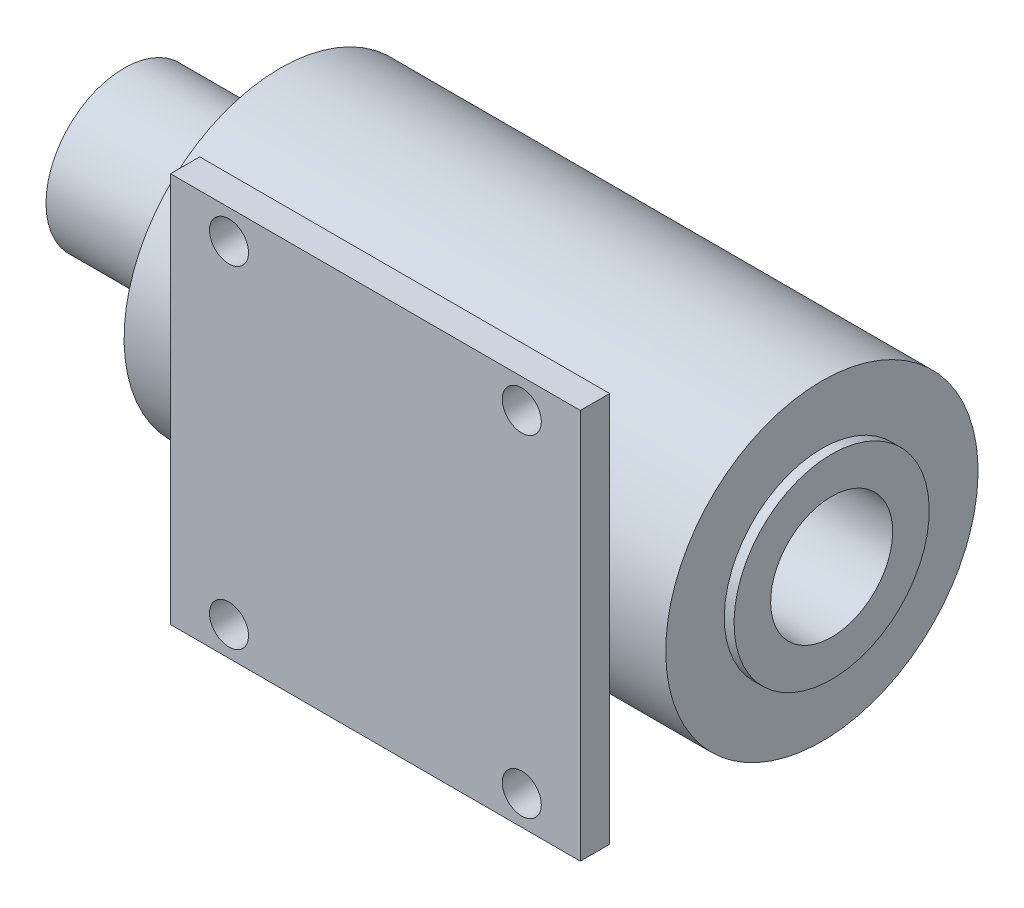
ISO-10303-21;
HEADER;
FILE_DESCRIPTION(('STEP AP214'),'2;1');
FILE_NAME('part.step','',(''),(''),'','','');
FILE_SCHEMA(('AUTOMOTIVE_DESIGN { 1 0 10303 214 1 1 1 1 }'));
ENDSEC;
DATA;
#1=APPLICATION_CONTEXT('core data for automotive mechanical design processes');
#2=APPLICATION_PROTOCOL_DEFINITION('international standard','automotive_design',2000,#1);
#3=PRODUCT_CONTEXT('',#1,'mechanical');
#4=PRODUCT('Part','Part','',(#3));
#5=PRODUCT_RELATED_PRODUCT_CATEGORY('part','',(#4));
#6=PRODUCT_DEFINITION_FORMATION('','',#4);
#7=PRODUCT_DEFINITION_CONTEXT('part definition',#1,'design');
#8=PRODUCT_DEFINITION('design','',#6,#7);
#9=PRODUCT_DEFINITION_SHAPE('','',#8);
#10=(LENGTH_UNIT() NAMED_UNIT(*) SI_UNIT(.MILLI.,.METRE.));
#11=(NAMED_UNIT(*) PLANE_ANGLE_UNIT() SI_UNIT($,.RADIAN.));
#12=(NAMED_UNIT(*) SI_UNIT($,.STERADIAN.) SOLID_ANGLE_UNIT());
#13=UNCERTAINTY_MEASURE_WITH_UNIT(LENGTH_MEASURE(1.E-05),#10,'distance_accuracy_value','');
#14=(GEOMETRIC_REPRESENTATION_CONTEXT(3) GLOBAL_UNCERTAINTY_ASSIGNED_CONTEXT((#13)) GLOBAL_UNIT_ASSIGNED_CONTEXT((#10,
#11,#12)) REPRESENTATION_CONTEXT('',''));
#15=CARTESIAN_POINT('',(0.,0.,0.));
#16=DIRECTION('',(0.,0.,1.));
#17=DIRECTION('',(1.,0.,0.));
#18=AXIS2_PLACEMENT_3D('',#15,#16,#17);
#19=CARTESIAN_POINT('',(36.5703722048743,-5.90587953913225,-16.));
#20=DIRECTION('',(1.,0.,0.));
#21=DIRECTION('',(0.,1.,0.));
#22=AXIS2_PLACEMENT_3D('',#19,#20,#21);
#23=PLANE('',#22);
#24=CARTESIAN_POINT('',(36.5703722048743,-5.90587953913225,-16.));
#25=DIRECTION('',(1.,0.,0.));
#26=DIRECTION('',(0.,1.,0.));
#27=AXIS2_PLACEMENT_3D('',#24,#25,#26);
#28=CIRCLE('',#27,16.);
#29=CARTESIAN_POINT('',(36.5703722048743,10.0941204608678,-16.));
#30=VERTEX_POINT('',#29);
#31=EDGE_CURVE('E51',#30,#30,#28,.T.);
#32=ORIENTED_EDGE('',*,*,#31,.T.);
#33=EDGE_LOOP('',(#32));
#34=FACE_BOUND('',#33,.T.);
#35=CARTESIAN_POINT('',(36.5703722048743,-5.90587953913225,-16.));
#36=DIRECTION('',(1.,0.,0.));
#37=DIRECTION('',(0.,1.,0.));
#38=AXIS2_PLACEMENT_3D('',#35,#36,#37);
#39=CIRCLE('',#38,10.);
#40=CARTESIAN_POINT('',(36.5703722048743,4.09412046086775,-16.));
#41=VERTEX_POINT('',#40);
#42=EDGE_CURVE('E61',#41,#41,#39,.T.);
#43=ORIENTED_EDGE('',*,*,#42,.F.);
#44=EDGE_LOOP('',(#43));
#45=FACE_BOUND('',#44,.T.);
#46=ADVANCED_FACE('F40',(#34,#45),#23,.T.);
#47=CARTESIAN_POINT('',(-18.9296277951257,-5.90587953913226,-16.));
#48=DIRECTION('',(1.,0.,0.));
#49=DIRECTION('',(0.,1.,0.));
#50=AXIS2_PLACEMENT_3D('',#47,#48,#49);
#51=PLANE('',#50);
#52=CARTESIAN_POINT('',(-18.9296277951257,-5.90587953913226,-16.));
#53=DIRECTION('',(1.,0.,0.));
#54=DIRECTION('',(0.,1.,0.));
#55=AXIS2_PLACEMENT_3D('',#52,#53,#54);
#56=CIRCLE('',#55,16.);
#57=CARTESIAN_POINT('',(-18.9296277951257,10.0941204608677,-16.));
#58=VERTEX_POINT('',#57);
#59=EDGE_CURVE('E47',#58,#58,#56,.T.);
#60=ORIENTED_EDGE('',*,*,#59,.F.);
#61=EDGE_LOOP('',(#60));
#62=FACE_BOUND('',#61,.T.);
#63=CARTESIAN_POINT('',(-18.9296277951257,-5.90587953913226,-16.));
#64=DIRECTION('',(1.,0.,0.));
#65=DIRECTION('',(0.,1.,0.));
#66=AXIS2_PLACEMENT_3D('',#63,#64,#65);
#67=CIRCLE('',#66,8.);
#68=CARTESIAN_POINT('',(-18.9296277951257,2.09412046086774,-16.));
#69=VERTEX_POINT('',#68);
#70=EDGE_CURVE('E11',#69,#69,#67,.F.);
#71=ORIENTED_EDGE('',*,*,#70,.F.);
#72=EDGE_LOOP('',(#71));
#73=FACE_BOUND('',#72,.T.);
#74=ADVANCED_FACE('F113',(#62,#73),#51,.F.);
#75=CARTESIAN_POINT('',(-18.9296277951257,-5.90587953913226,-16.));
#76=DIRECTION('',(1.,0.,0.));
#77=DIRECTION('',(0.,1.,0.));
#78=AXIS2_PLACEMENT_3D('',#75,#76,#77);
#79=CYLINDRICAL_SURFACE('',#78,16.);
#80=ORIENTED_EDGE('',*,*,#59,.T.);
#81=EDGE_LOOP('',(#80));
#82=FACE_BOUND('',#81,.T.);
#83=ORIENTED_EDGE('',*,*,#31,.F.);
#84=EDGE_LOOP('',(#83));
#85=FACE_BOUND('',#84,.T.);
#86=ADVANCED_FACE('F42',(#82,#85),#79,.T.);
#87=CARTESIAN_POINT('',(-34.9296277951257,-5.90587953913226,-16.));
#88=DIRECTION('',(1.,0.,0.));
#89=DIRECTION('',(0.,1.,0.));
#90=AXIS2_PLACEMENT_3D('',#87,#88,#89);
#91=CYLINDRICAL_SURFACE('',#90,8.);
#92=CARTESIAN_POINT('',(-34.9296277951257,-5.90587953913226,-16.));
#93=DIRECTION('',(-1.,0.,0.));
#94=DIRECTION('',(0.,-1.,0.));
#95=AXIS2_PLACEMENT_3D('',#92,#93,#94);
#96=CIRCLE('',#95,8.);
#97=CARTESIAN_POINT('',(-34.9296277951257,-13.9058795391323,-16.));
#98=VERTEX_POINT('',#97);
#99=EDGE_CURVE('E55',#98,#98,#96,.T.);
#100=ORIENTED_EDGE('',*,*,#99,.F.);
#101=EDGE_LOOP('',(#100));
#102=FACE_BOUND('',#101,.T.);
#103=ORIENTED_EDGE('',*,*,#70,.T.);
#104=EDGE_LOOP('',(#103));
#105=FACE_BOUND('',#104,.T.);
#106=ADVANCED_FACE('F121',(#102,#105),#91,.T.);
#107=CARTESIAN_POINT('',(-34.9296277951257,-5.90587953913226,-16.));
#108=DIRECTION('',(-1.,0.,0.));
#109=DIRECTION('',(0.,-1.,0.));
#110=AXIS2_PLACEMENT_3D('',#107,#108,#109);
#111=PLANE('',#110);
#112=CARTESIAN_POINT('',(-34.9296277951257,-5.90587953913226,-16.));
#113=DIRECTION('',(1.,0.,0.));
#114=DIRECTION('',(0.,1.,0.));
#115=AXIS2_PLACEMENT_3D('',#112,#113,#114);
#116=CIRCLE('',#115,2.38125);
#117=CARTESIAN_POINT('',(-34.9296277951257,-3.52462953913226,-16.));
#118=VERTEX_POINT('',#117);
#119=EDGE_CURVE('E70',#118,#118,#116,.T.);
#120=ORIENTED_EDGE('',*,*,#119,.T.);
#121=EDGE_LOOP('',(#120));
#122=FACE_BOUND('',#121,.T.);
#123=ORIENTED_EDGE('',*,*,#99,.T.);
#124=EDGE_LOOP('',(#123));
#125=FACE_BOUND('',#124,.T.);
#126=ADVANCED_FACE('F79',(#122,#125),#111,.T.);
#127=CARTESIAN_POINT('',(37.5703722048743,-5.90587953913225,-16.));
#128=DIRECTION('',(-1.,0.,0.));
#129=DIRECTION('',(0.,-1.,0.));
#130=AXIS2_PLACEMENT_3D('',#127,#128,#129);
#131=CYLINDRICAL_SURFACE('',#130,10.);
#132=CARTESIAN_POINT('',(37.5703722048743,-5.90587953913225,-16.));
#133=DIRECTION('',(1.,0.,0.));
#134=DIRECTION('',(0.,1.,0.));
#135=AXIS2_PLACEMENT_3D('',#132,#133,#134);
#136=CIRCLE('',#135,10.);
#137=CARTESIAN_POINT('',(37.5703722048743,4.09412046086775,-16.));
#138=VERTEX_POINT('',#137);
#139=EDGE_CURVE('E60',#138,#138,#136,.T.);
#140=ORIENTED_EDGE('',*,*,#139,.F.);
#141=EDGE_LOOP('',(#140));
#142=FACE_BOUND('',#141,.T.);
#143=ORIENTED_EDGE('',*,*,#42,.T.);
#144=EDGE_LOOP('',(#143));
#145=FACE_BOUND('',#144,.T.);
#146=ADVANCED_FACE('F103',(#142,#145),#131,.T.);
#147=CARTESIAN_POINT('',(37.5703722048743,-5.90587953913225,-16.));
#148=DIRECTION('',(1.,0.,0.));
#149=DIRECTION('',(0.,1.,0.));
#150=AXIS2_PLACEMENT_3D('',#147,#148,#149);
#151=PLANE('',#150);
#152=CARTESIAN_POINT('',(37.5703722048743,-5.90587953913225,-16.));
#153=DIRECTION('',(1.,0.,0.));
#154=DIRECTION('',(0.,1.,0.));
#155=AXIS2_PLACEMENT_3D('',#152,#153,#154);
#156=CIRCLE('',#155,6.25);
#157=CARTESIAN_POINT('',(37.5703722048743,0.344120460867751,-16.));
#158=VERTEX_POINT('',#157);
#159=EDGE_CURVE('E67',#158,#158,#156,.T.);
#160=ORIENTED_EDGE('',*,*,#159,.F.);
#161=EDGE_LOOP('',(#160));
#162=FACE_BOUND('',#161,.T.);
#163=ORIENTED_EDGE('',*,*,#139,.T.);
#164=EDGE_LOOP('',(#163));
#165=FACE_BOUND('',#164,.T.);
#166=ADVANCED_FACE('F97',(#162,#165),#151,.T.);
#167=CARTESIAN_POINT('',(-13.4296277951257,-5.90587953913226,-16.));
#168=DIRECTION('',(1.,0.,0.));
#169=DIRECTION('',(0.,1.,0.));
#170=AXIS2_PLACEMENT_3D('',#167,#168,#169);
#171=CYLINDRICAL_SURFACE('',#170,6.25);
#172=CARTESIAN_POINT('',(-13.4296277951257,-5.90587953913226,-16.));
#173=DIRECTION('',(1.,0.,0.));
#174=DIRECTION('',(0.,1.,0.));
#175=AXIS2_PLACEMENT_3D('',#172,#173,#174);
#176=CIRCLE('',#175,6.25);
#177=CARTESIAN_POINT('',(-13.4296277951257,0.344120460867741,-16.));
#178=VERTEX_POINT('',#177);
#179=EDGE_CURVE('E64',#178,#178,#176,.T.);
#180=ORIENTED_EDGE('',*,*,#179,.F.);
#181=EDGE_LOOP('',(#180));
#182=FACE_BOUND('',#181,.T.);
#183=ORIENTED_EDGE('',*,*,#159,.T.);
#184=EDGE_LOOP('',(#183));
#185=FACE_BOUND('',#184,.T.);
#186=ADVANCED_FACE('F91',(#182,#185),#171,.F.);
#187=CARTESIAN_POINT('',(-13.4296277951257,-5.90587953913226,-16.));
#188=DIRECTION('',(1.,0.,0.));
#189=DIRECTION('',(0.,1.,0.));
#190=AXIS2_PLACEMENT_3D('',#187,#188,#189);
#191=PLANE('',#190);
#192=CARTESIAN_POINT('',(-13.4296277951257,-5.90587953913226,-16.));
#193=DIRECTION('',(1.,0.,0.));
#194=DIRECTION('',(0.,1.,0.));
#195=AXIS2_PLACEMENT_3D('',#192,#193,#194);
#196=CIRCLE('',#195,2.38125);
#197=CARTESIAN_POINT('',(-13.4296277951257,-3.52462953913226,-16.));
#198=VERTEX_POINT('',#197);
#199=EDGE_CURVE('E73',#198,#198,#196,.T.);
#200=ORIENTED_EDGE('',*,*,#199,.F.);
#201=EDGE_LOOP('',(#200));
#202=FACE_BOUND('',#201,.T.);
#203=ORIENTED_EDGE('',*,*,#179,.T.);
#204=EDGE_LOOP('',(#203));
#205=FACE_BOUND('',#204,.T.);
#206=ADVANCED_FACE('F85',(#202,#205),#191,.T.);
#207=CARTESIAN_POINT('',(-34.9296277951257,-5.90587953913226,-16.));
#208=DIRECTION('',(1.,0.,0.));
#209=DIRECTION('',(0.,1.,0.));
#210=AXIS2_PLACEMENT_3D('',#207,#208,#209);
#211=CYLINDRICAL_SURFACE('',#210,2.38125);
#212=ORIENTED_EDGE('',*,*,#119,.F.);
#213=EDGE_LOOP('',(#212));
#214=FACE_BOUND('',#213,.T.);
#215=ORIENTED_EDGE('',*,*,#199,.T.);
#216=EDGE_LOOP('',(#215));
#217=FACE_BOUND('',#216,.T.);
#218=ADVANCED_FACE('F82',(#214,#217),#211,.F.);
#219=CLOSED_SHELL('',(#46,#74,#86,#106,#126,#146,#166,#186,#206,#218));
#220=MANIFOLD_SOLID_BREP('B2',#219);
#221=CARTESIAN_POINT('',(-11.1796277951257,-25.9058795391323,3.));
#222=DIRECTION('',(0.,0.,1.));
#223=DIRECTION('',(1.,0.,0.));
#224=AXIS2_PLACEMENT_3D('',#221,#222,#223);
#225=PLANE('',#224);
#226=CARTESIAN_POINT('',(24.8203722048743,11.0941204608678,3.));
#227=DIRECTION('',(0.,0.,1.));
#228=DIRECTION('',(1.,0.,0.));
#229=AXIS2_PLACEMENT_3D('',#226,#227,#228);
#230=CIRCLE('',#229,2.);
#231=CARTESIAN_POINT('',(26.8203722048743,11.0941204608678,3.));
#232=VERTEX_POINT('',#231);
#233=EDGE_CURVE('E279',#232,#232,#230,.T.);
#234=ORIENTED_EDGE('',*,*,#233,.F.);
#235=EDGE_LOOP('',(#234));
#236=FACE_BOUND('',#235,.T.);
#237=CARTESIAN_POINT('',(-5.17962779512572,11.0941204608678,3.));
#238=DIRECTION('',(0.,0.,1.));
#239=DIRECTION('',(1.,0.,0.));
#240=AXIS2_PLACEMENT_3D('',#237,#238,#239);
#241=CIRCLE('',#240,2.);
#242=CARTESIAN_POINT('',(-3.17962779512572,11.0941204608678,3.));
#243=VERTEX_POINT('',#242);
#244=EDGE_CURVE('E258',#243,#243,#241,.T.);
#245=ORIENTED_EDGE('',*,*,#244,.F.);
#246=EDGE_LOOP('',(#245));
#247=FACE_BOUND('',#246,.T.);
#248=DIRECTION('',(0.,-1.,0.));
#249=VECTOR('',#248,1.);
#250=CARTESIAN_POINT('',(-11.1796277951257,14.0941204608677,3.));
#251=LINE('',#250,#249);
#252=CARTESIAN_POINT('',(-11.1796277951257,14.0941204608677,3.));
#253=VERTEX_POINT('',#252);
#254=CARTESIAN_POINT('',(-11.1796277951257,-25.9058795391323,3.));
#255=VERTEX_POINT('',#254);
#256=EDGE_CURVE('E243',#253,#255,#251,.T.);
#257=ORIENTED_EDGE('',*,*,#256,.T.);
#258=DIRECTION('',(1.,0.,0.));
#259=VECTOR('',#258,1.);
#260=CARTESIAN_POINT('',(-11.1796277951257,-25.9058795391323,3.));
#261=LINE('',#260,#259);
#262=CARTESIAN_POINT('',(30.8203722048743,-25.9058795391322,3.));
#263=VERTEX_POINT('',#262);
#264=EDGE_CURVE('E238',#255,#263,#261,.T.);
#265=ORIENTED_EDGE('',*,*,#264,.T.);
#266=DIRECTION('',(0.,1.,0.));
#267=VECTOR('',#266,1.);
#268=CARTESIAN_POINT('',(30.8203722048743,14.0941204608678,3.));
#269=LINE('',#268,#267);
#270=CARTESIAN_POINT('',(30.8203722048743,14.0941204608678,3.));
#271=VERTEX_POINT('',#270);
#272=EDGE_CURVE('E241',#263,#271,#269,.T.);
#273=ORIENTED_EDGE('',*,*,#272,.T.);
#274=DIRECTION('',(-1.,0.,0.));
#275=VECTOR('',#274,1.);
#276=CARTESIAN_POINT('',(-11.1796277951257,14.0941204608677,3.));
#277=LINE('',#276,#275);
#278=EDGE_CURVE('E208',#271,#253,#277,.T.);
#279=ORIENTED_EDGE('',*,*,#278,.T.);
#280=EDGE_LOOP('',(#257,#265,#273,#279));
#281=FACE_BOUND('',#280,.T.);
#282=CARTESIAN_POINT('',(-5.17962779512572,-22.9058795391323,3.));
#283=DIRECTION('',(0.,0.,1.));
#284=DIRECTION('',(1.,0.,0.));
#285=AXIS2_PLACEMENT_3D('',#282,#283,#284);
#286=CIRCLE('',#285,2.);
#287=CARTESIAN_POINT('',(-3.17962779512571,-22.9058795391323,3.));
#288=VERTEX_POINT('',#287);
#289=EDGE_CURVE('E273',#288,#288,#286,.T.);
#290=ORIENTED_EDGE('',*,*,#289,.F.);
#291=EDGE_LOOP('',(#290));
#292=FACE_BOUND('',#291,.T.);
#293=CARTESIAN_POINT('',(24.8203722048743,-22.9058795391322,3.));
#294=DIRECTION('',(0.,0.,1.));
#295=DIRECTION('',(1.,0.,0.));
#296=AXIS2_PLACEMENT_3D('',#293,#294,#295);
#297=CIRCLE('',#296,2.00000000000001);
#298=CARTESIAN_POINT('',(26.8203722048743,-22.9058795391322,3.));
#299=VERTEX_POINT('',#298);
#300=EDGE_CURVE('E285',#299,#299,#297,.T.);
#301=ORIENTED_EDGE('',*,*,#300,.F.);
#302=EDGE_LOOP('',(#301));
#303=FACE_BOUND('',#302,.T.);
#304=ADVANCED_FACE('F191',(#236,#247,#281,#292,#303),#225,.T.);
#305=CARTESIAN_POINT('',(-11.1796277951257,-25.9058795391323,0.));
#306=DIRECTION('',(0.,0.,1.));
#307=DIRECTION('',(1.,0.,0.));
#308=AXIS2_PLACEMENT_3D('',#305,#306,#307);
#309=PLANE('',#308);
#310=CARTESIAN_POINT('',(24.8203722048743,11.0941204608678,0.));
#311=DIRECTION('',(0.,0.,1.));
#312=DIRECTION('',(1.,0.,0.));
#313=AXIS2_PLACEMENT_3D('',#310,#311,#312);
#314=CIRCLE('',#313,2.);
#315=CARTESIAN_POINT('',(26.8203722048743,11.0941204608678,0.));
#316=VERTEX_POINT('',#315);
#317=EDGE_CURVE('E282',#316,#316,#314,.T.);
#318=ORIENTED_EDGE('',*,*,#317,.T.);
#319=EDGE_LOOP('',(#318));
#320=FACE_BOUND('',#319,.T.);
#321=CARTESIAN_POINT('',(-5.17962779512572,11.0941204608678,0.));
#322=DIRECTION('',(0.,0.,1.));
#323=DIRECTION('',(1.,0.,0.));
#324=AXIS2_PLACEMENT_3D('',#321,#322,#323);
#325=CIRCLE('',#324,2.);
#326=CARTESIAN_POINT('',(-3.17962779512572,11.0941204608678,0.));
#327=VERTEX_POINT('',#326);
#328=EDGE_CURVE('E270',#327,#327,#325,.T.);
#329=ORIENTED_EDGE('',*,*,#328,.T.);
#330=EDGE_LOOP('',(#329));
#331=FACE_BOUND('',#330,.T.);
#332=DIRECTION('',(0.,-1.,0.));
#333=VECTOR('',#332,1.);
#334=CARTESIAN_POINT('',(-11.1796277951257,14.0941204608677,0.));
#335=LINE('',#334,#333);
#336=CARTESIAN_POINT('',(-11.1796277951257,14.0941204608677,0.));
#337=VERTEX_POINT('',#336);
#338=CARTESIAN_POINT('',(-11.1796277951257,-25.9058795391323,0.));
#339=VERTEX_POINT('',#338);
#340=EDGE_CURVE('E255',#337,#339,#335,.T.);
#341=ORIENTED_EDGE('',*,*,#340,.F.);
#342=DIRECTION('',(-1.,0.,0.));
#343=VECTOR('',#342,1.);
#344=CARTESIAN_POINT('',(-11.1796277951257,14.0941204608677,0.));
#345=LINE('',#344,#343);
#346=CARTESIAN_POINT('',(30.8203722048743,14.0941204608678,0.));
#347=VERTEX_POINT('',#346);
#348=EDGE_CURVE('E231',#347,#337,#345,.T.);
#349=ORIENTED_EDGE('',*,*,#348,.F.);
#350=DIRECTION('',(0.,1.,0.));
#351=VECTOR('',#350,1.);
#352=CARTESIAN_POINT('',(30.8203722048743,14.0941204608678,0.));
#353=LINE('',#352,#351);
#354=CARTESIAN_POINT('',(30.8203722048743,-25.9058795391322,0.));
#355=VERTEX_POINT('',#354);
#356=EDGE_CURVE('E225',#355,#347,#353,.T.);
#357=ORIENTED_EDGE('',*,*,#356,.F.);
#358=DIRECTION('',(1.,0.,0.));
#359=VECTOR('',#358,1.);
#360=CARTESIAN_POINT('',(-11.1796277951257,-25.9058795391323,0.));
#361=LINE('',#360,#359);
#362=EDGE_CURVE('E247',#339,#355,#361,.T.);
#363=ORIENTED_EDGE('',*,*,#362,.F.);
#364=EDGE_LOOP('',(#341,#349,#357,#363));
#365=FACE_BOUND('',#364,.T.);
#366=CARTESIAN_POINT('',(-5.17962779512572,-22.9058795391323,0.));
#367=DIRECTION('',(0.,0.,1.));
#368=DIRECTION('',(1.,0.,0.));
#369=AXIS2_PLACEMENT_3D('',#366,#367,#368);
#370=CIRCLE('',#369,2.);
#371=CARTESIAN_POINT('',(-3.17962779512571,-22.9058795391323,0.));
#372=VERTEX_POINT('',#371);
#373=EDGE_CURVE('E276',#372,#372,#370,.T.);
#374=ORIENTED_EDGE('',*,*,#373,.T.);
#375=EDGE_LOOP('',(#374));
#376=FACE_BOUND('',#375,.T.);
#377=CARTESIAN_POINT('',(24.8203722048743,-22.9058795391322,0.));
#378=DIRECTION('',(0.,0.,1.));
#379=DIRECTION('',(1.,0.,0.));
#380=AXIS2_PLACEMENT_3D('',#377,#378,#379);
#381=CIRCLE('',#380,2.00000000000001);
#382=CARTESIAN_POINT('',(26.8203722048743,-22.9058795391322,0.));
#383=VERTEX_POINT('',#382);
#384=EDGE_CURVE('E288',#383,#383,#381,.T.);
#385=ORIENTED_EDGE('',*,*,#384,.T.);
#386=EDGE_LOOP('',(#385));
#387=FACE_BOUND('',#386,.T.);
#388=ADVANCED_FACE('F266',(#320,#331,#365,#376,#387),#309,.F.);
#389=CARTESIAN_POINT('',(-11.1796277951257,14.0941204608677,3.));
#390=DIRECTION('',(1.,0.,0.));
#391=DIRECTION('',(0.,1.,0.));
#392=AXIS2_PLACEMENT_3D('',#389,#390,#391);
#393=PLANE('',#392);
#394=ORIENTED_EDGE('',*,*,#340,.T.);
#395=DIRECTION('',(0.,0.,-1.));
#396=VECTOR('',#395,1.);
#397=CARTESIAN_POINT('',(-11.1796277951257,-25.9058795391323,3.));
#398=LINE('',#397,#396);
#399=EDGE_CURVE('E38',#255,#339,#398,.T.);
#400=ORIENTED_EDGE('',*,*,#399,.F.);
#401=ORIENTED_EDGE('',*,*,#256,.F.);
#402=DIRECTION('',(0.,0.,-1.));
#403=VECTOR('',#402,1.);
#404=CARTESIAN_POINT('',(-11.1796277951257,14.0941204608677,3.));
#405=LINE('',#404,#403);
#406=EDGE_CURVE('E251',#253,#337,#405,.T.);
#407=ORIENTED_EDGE('',*,*,#406,.T.);
#408=EDGE_LOOP('',(#394,#400,#401,#407));
#409=FACE_BOUND('',#408,.T.);
#410=ADVANCED_FACE('F193',(#409),#393,.F.);
#411=CARTESIAN_POINT('',(-11.1796277951257,-25.9058795391323,3.));
#412=DIRECTION('',(0.,1.,0.));
#413=DIRECTION('',(-1.,0.,0.));
#414=AXIS2_PLACEMENT_3D('',#411,#412,#413);
#415=PLANE('',#414);
#416=ORIENTED_EDGE('',*,*,#362,.T.);
#417=DIRECTION('',(0.,0.,-1.));
#418=VECTOR('',#417,1.);
#419=CARTESIAN_POINT('',(30.8203722048743,-25.9058795391322,3.));
#420=LINE('',#419,#418);
#421=EDGE_CURVE('E200',#263,#355,#420,.T.);
#422=ORIENTED_EDGE('',*,*,#421,.F.);
#423=ORIENTED_EDGE('',*,*,#264,.F.);
#424=ORIENTED_EDGE('',*,*,#399,.T.);
#425=EDGE_LOOP('',(#416,#422,#423,#424));
#426=FACE_BOUND('',#425,.T.);
#427=ADVANCED_FACE('F246',(#426),#415,.F.);
#428=CARTESIAN_POINT('',(30.8203722048743,14.0941204608678,3.));
#429=DIRECTION('',(-1.,0.,0.));
#430=DIRECTION('',(0.,-1.,0.));
#431=AXIS2_PLACEMENT_3D('',#428,#429,#430);
#432=PLANE('',#431);
#433=ORIENTED_EDGE('',*,*,#356,.T.);
#434=DIRECTION('',(0.,0.,-1.));
#435=VECTOR('',#434,1.);
#436=CARTESIAN_POINT('',(30.8203722048743,14.0941204608678,3.));
#437=LINE('',#436,#435);
#438=EDGE_CURVE('E248',#271,#347,#437,.T.);
#439=ORIENTED_EDGE('',*,*,#438,.F.);
#440=ORIENTED_EDGE('',*,*,#272,.F.);
#441=ORIENTED_EDGE('',*,*,#421,.T.);
#442=EDGE_LOOP('',(#433,#439,#440,#441));
#443=FACE_BOUND('',#442,.T.);
#444=ADVANCED_FACE('F249',(#443),#432,.F.);
#445=CARTESIAN_POINT('',(-11.1796277951257,14.0941204608677,3.));
#446=DIRECTION('',(0.,-1.,0.));
#447=DIRECTION('',(1.,0.,0.));
#448=AXIS2_PLACEMENT_3D('',#445,#446,#447);
#449=PLANE('',#448);
#450=ORIENTED_EDGE('',*,*,#348,.T.);
#451=ORIENTED_EDGE('',*,*,#406,.F.);
#452=ORIENTED_EDGE('',*,*,#278,.F.);
#453=ORIENTED_EDGE('',*,*,#438,.T.);
#454=EDGE_LOOP('',(#450,#451,#452,#453));
#455=FACE_BOUND('',#454,.T.);
#456=ADVANCED_FACE('F263',(#455),#449,.F.);
#457=CARTESIAN_POINT('',(-5.17962779512572,11.0941204608678,3.));
#458=DIRECTION('',(0.,0.,-1.));
#459=DIRECTION('',(-1.,0.,0.));
#460=AXIS2_PLACEMENT_3D('',#457,#458,#459);
#461=CYLINDRICAL_SURFACE('',#460,2.);
#462=ORIENTED_EDGE('',*,*,#244,.T.);
#463=EDGE_LOOP('',(#462));
#464=FACE_BOUND('',#463,.T.);
#465=ORIENTED_EDGE('',*,*,#328,.F.);
#466=EDGE_LOOP('',(#465));
#467=FACE_BOUND('',#466,.T.);
#468=ADVANCED_FACE('F308',(#464,#467),#461,.F.);
#469=CARTESIAN_POINT('',(-5.17962779512572,-22.9058795391323,3.));
#470=DIRECTION('',(0.,0.,-1.));
#471=DIRECTION('',(-1.,0.,0.));
#472=AXIS2_PLACEMENT_3D('',#469,#470,#471);
#473=CYLINDRICAL_SURFACE('',#472,2.);
#474=ORIENTED_EDGE('',*,*,#289,.T.);
#475=EDGE_LOOP('',(#474));
#476=FACE_BOUND('',#475,.T.);
#477=ORIENTED_EDGE('',*,*,#373,.F.);
#478=EDGE_LOOP('',(#477));
#479=FACE_BOUND('',#478,.T.);
#480=ADVANCED_FACE('F354',(#476,#479),#473,.F.);
#481=CARTESIAN_POINT('',(24.8203722048743,11.0941204608678,3.));
#482=DIRECTION('',(0.,0.,-1.));
#483=DIRECTION('',(-1.,0.,0.));
#484=AXIS2_PLACEMENT_3D('',#481,#482,#483);
#485=CYLINDRICAL_SURFACE('',#484,2.);
#486=ORIENTED_EDGE('',*,*,#233,.T.);
#487=EDGE_LOOP('',(#486));
#488=FACE_BOUND('',#487,.T.);
#489=ORIENTED_EDGE('',*,*,#317,.F.);
#490=EDGE_LOOP('',(#489));
#491=FACE_BOUND('',#490,.T.);
#492=ADVANCED_FACE('F362',(#488,#491),#485,.F.);
#493=CARTESIAN_POINT('',(24.8203722048743,-22.9058795391322,3.));
#494=DIRECTION('',(0.,0.,-1.));
#495=DIRECTION('',(-1.,0.,0.));
#496=AXIS2_PLACEMENT_3D('',#493,#494,#495);
#497=CYLINDRICAL_SURFACE('',#496,2.00000000000001);
#498=ORIENTED_EDGE('',*,*,#300,.T.);
#499=EDGE_LOOP('',(#498));
#500=FACE_BOUND('',#499,.T.);
#501=ORIENTED_EDGE('',*,*,#384,.F.);
#502=EDGE_LOOP('',(#501));
#503=FACE_BOUND('',#502,.T.);
#504=ADVANCED_FACE('F294',(#500,#503),#497,.F.);
#505=CLOSED_SHELL('',(#304,#388,#410,#427,#444,#456,#468,#480,#492,#504));
#506=MANIFOLD_SOLID_BREP('B6',#505);
#507=ADVANCED_BREP_SHAPE_REPRESENTATION('',(#18,#220,#506),#14);
#508=SHAPE_DEFINITION_REPRESENTATION(#9,#507);
ENDSEC;
END-ISO-10303-21;
